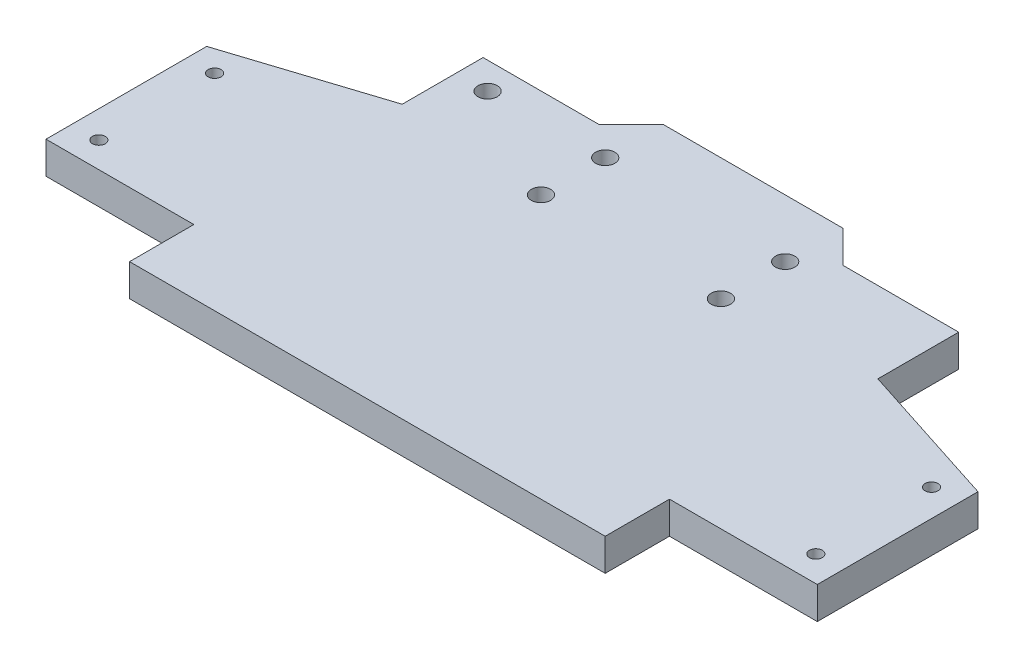
ISO-10303-21;
HEADER;
FILE_DESCRIPTION(('STEP AP214'),'2;1');
FILE_NAME('part.step','',(''),(''),'','','');
FILE_SCHEMA(('AUTOMOTIVE_DESIGN { 1 0 10303 214 1 1 1 1 }'));
ENDSEC;
DATA;
#1=APPLICATION_CONTEXT('core data for automotive mechanical design processes');
#2=APPLICATION_PROTOCOL_DEFINITION('international standard','automotive_design',2000,#1);
#3=PRODUCT_CONTEXT('',#1,'mechanical');
#4=PRODUCT('Part','Part','',(#3));
#5=PRODUCT_RELATED_PRODUCT_CATEGORY('part','',(#4));
#6=PRODUCT_DEFINITION_FORMATION('','',#4);
#7=PRODUCT_DEFINITION_CONTEXT('part definition',#1,'design');
#8=PRODUCT_DEFINITION('design','',#6,#7);
#9=PRODUCT_DEFINITION_SHAPE('','',#8);
#10=(LENGTH_UNIT() NAMED_UNIT(*) SI_UNIT(.MILLI.,.METRE.));
#11=(NAMED_UNIT(*) PLANE_ANGLE_UNIT() SI_UNIT($,.RADIAN.));
#12=(NAMED_UNIT(*) SI_UNIT($,.STERADIAN.) SOLID_ANGLE_UNIT());
#13=UNCERTAINTY_MEASURE_WITH_UNIT(LENGTH_MEASURE(1.E-05),#10,'distance_accuracy_value','');
#14=(GEOMETRIC_REPRESENTATION_CONTEXT(3) GLOBAL_UNCERTAINTY_ASSIGNED_CONTEXT((#13)) GLOBAL_UNIT_ASSIGNED_CONTEXT((#10,
#11,#12)) REPRESENTATION_CONTEXT('',''));
#15=CARTESIAN_POINT('',(0.,0.,0.));
#16=DIRECTION('',(0.,0.,1.));
#17=DIRECTION('',(1.,0.,0.));
#18=AXIS2_PLACEMENT_3D('',#15,#16,#17);
#19=CARTESIAN_POINT('',(-74.,3.,140.));
#20=DIRECTION('',(0.,0.,-1.));
#21=DIRECTION('',(-1.,0.,0.));
#22=AXIS2_PLACEMENT_3D('',#19,#20,#21);
#23=PLANE('',#22);
#24=DIRECTION('',(1.,0.,0.));
#25=VECTOR('',#24,1.);
#26=CARTESIAN_POINT('',(-74.,0.,140.));
#27=LINE('',#26,#25);
#28=CARTESIAN_POINT('',(-74.,0.,140.));
#29=VERTEX_POINT('',#28);
#30=CARTESIAN_POINT('',(-51.,0.,140.));
#31=VERTEX_POINT('',#30);
#32=EDGE_CURVE('E244',#29,#31,#27,.T.);
#33=ORIENTED_EDGE('',*,*,#32,.T.);
#34=DIRECTION('',(0.,-1.,0.));
#35=VECTOR('',#34,1.);
#36=CARTESIAN_POINT('',(-51.,5.,140.));
#37=LINE('',#36,#35);
#38=CARTESIAN_POINT('',(-51.,5.,140.));
#39=VERTEX_POINT('',#38);
#40=EDGE_CURVE('E217',#39,#31,#37,.T.);
#41=ORIENTED_EDGE('',*,*,#40,.F.);
#42=DIRECTION('',(1.,0.,0.));
#43=VECTOR('',#42,1.);
#44=CARTESIAN_POINT('',(-74.,5.,140.));
#45=LINE('',#44,#43);
#46=CARTESIAN_POINT('',(-74.,5.,140.));
#47=VERTEX_POINT('',#46);
#48=EDGE_CURVE('E213',#47,#39,#45,.T.);
#49=ORIENTED_EDGE('',*,*,#48,.F.);
#50=DIRECTION('',(0.,-1.,0.));
#51=VECTOR('',#50,1.);
#52=CARTESIAN_POINT('',(-74.,3.,140.));
#53=LINE('',#52,#51);
#54=EDGE_CURVE('E261',#47,#29,#53,.T.);
#55=ORIENTED_EDGE('',*,*,#54,.T.);
#56=EDGE_LOOP('',(#33,#41,#49,#55));
#57=FACE_BOUND('',#56,.T.);
#58=ADVANCED_FACE('F37',(#57),#23,.F.);
#59=DIRECTION('',(0.,-1.,0.));
#60=VECTOR('',#59,1.);
#61=CARTESIAN_POINT('',(23.,5.,140.));
#62=LINE('',#61,#60);
#63=CARTESIAN_POINT('',(23.,5.,140.));
#64=VERTEX_POINT('',#63);
#65=CARTESIAN_POINT('',(23.,0.,140.));
#66=VERTEX_POINT('',#65);
#67=EDGE_CURVE('E179',#64,#66,#62,.T.);
#68=ORIENTED_EDGE('',*,*,#67,.T.);
#69=CARTESIAN_POINT('',(46.,0.,140.));
#70=VERTEX_POINT('',#69);
#71=EDGE_CURVE('E243',#66,#70,#27,.T.);
#72=ORIENTED_EDGE('',*,*,#71,.T.);
#73=DIRECTION('',(0.,-1.,0.));
#74=VECTOR('',#73,1.);
#75=CARTESIAN_POINT('',(46.,3.,140.));
#76=LINE('',#75,#74);
#77=CARTESIAN_POINT('',(46.,5.,140.));
#78=VERTEX_POINT('',#77);
#79=EDGE_CURVE('E44',#78,#70,#76,.T.);
#80=ORIENTED_EDGE('',*,*,#79,.F.);
#81=DIRECTION('',(1.,0.,0.));
#82=VECTOR('',#81,1.);
#83=CARTESIAN_POINT('',(46.,5.,140.));
#84=LINE('',#83,#82);
#85=EDGE_CURVE('E190',#64,#78,#84,.T.);
#86=ORIENTED_EDGE('',*,*,#85,.F.);
#87=EDGE_LOOP('',(#68,#72,#80,#86));
#88=FACE_BOUND('',#87,.T.);
#89=ADVANCED_FACE('F280',(#88),#23,.F.);
#90=CARTESIAN_POINT('',(15.,3.,105.));
#91=DIRECTION('',(-0.307002779922758,0.,0.951708617760551));
#92=DIRECTION('',(0.951708617760551,0.,0.307002779922758));
#93=AXIS2_PLACEMENT_3D('',#90,#91,#92);
#94=PLANE('',#93);
#95=DIRECTION('',(-0.951708617760551,0.,-0.307002779922758));
#96=VECTOR('',#95,1.);
#97=CARTESIAN_POINT('',(15.,0.,105.));
#98=LINE('',#97,#96);
#99=CARTESIAN_POINT('',(46.,0.,115.));
#100=VERTEX_POINT('',#99);
#101=CARTESIAN_POINT('',(23.,0.,107.58064516129));
#102=VERTEX_POINT('',#101);
#103=EDGE_CURVE('E249',#100,#102,#98,.T.);
#104=ORIENTED_EDGE('',*,*,#103,.T.);
#105=DIRECTION('',(0.,-1.,0.));
#106=VECTOR('',#105,1.);
#107=CARTESIAN_POINT('',(23.,5.,107.58064516129));
#108=LINE('',#107,#106);
#109=CARTESIAN_POINT('',(23.,5.,107.58064516129));
#110=VERTEX_POINT('',#109);
#111=EDGE_CURVE('E176',#110,#102,#108,.T.);
#112=ORIENTED_EDGE('',*,*,#111,.F.);
#113=DIRECTION('',(-0.951708617760551,0.,-0.307002779922758));
#114=VECTOR('',#113,1.);
#115=CARTESIAN_POINT('',(23.,5.,107.58064516129));
#116=LINE('',#115,#114);
#117=CARTESIAN_POINT('',(46.,5.,115.));
#118=VERTEX_POINT('',#117);
#119=EDGE_CURVE('E193',#118,#110,#116,.T.);
#120=ORIENTED_EDGE('',*,*,#119,.F.);
#121=DIRECTION('',(0.,-1.,0.));
#122=VECTOR('',#121,1.);
#123=CARTESIAN_POINT('',(46.,3.,115.));
#124=LINE('',#123,#122);
#125=EDGE_CURVE('E271',#118,#100,#124,.T.);
#126=ORIENTED_EDGE('',*,*,#125,.T.);
#127=EDGE_LOOP('',(#104,#112,#120,#126));
#128=FACE_BOUND('',#127,.T.);
#129=ADVANCED_FACE('F308',(#128),#94,.F.);
#130=CARTESIAN_POINT('',(0.,3.,90.));
#131=DIRECTION('',(-0.707106781186548,0.,0.707106781186547));
#132=DIRECTION('',(0.707106781186547,0.,0.707106781186548));
#133=AXIS2_PLACEMENT_3D('',#130,#131,#132);
#134=PLANE('',#133);
#135=DIRECTION('',(0.,-1.,0.));
#136=VECTOR('',#135,1.);
#137=CARTESIAN_POINT('',(5.00000000000003,5.,95.));
#138=LINE('',#137,#136);
#139=CARTESIAN_POINT('',(5.00000000000003,5.,95.));
#140=VERTEX_POINT('',#139);
#141=CARTESIAN_POINT('',(5.00000000000003,0.,95.));
#142=VERTEX_POINT('',#141);
#143=EDGE_CURVE('E319',#140,#142,#138,.T.);
#144=ORIENTED_EDGE('',*,*,#143,.T.);
#145=DIRECTION('',(-0.707106781186547,0.,-0.707106781186548));
#146=VECTOR('',#145,1.);
#147=CARTESIAN_POINT('',(0.,0.,90.));
#148=LINE('',#147,#146);
#149=CARTESIAN_POINT('',(0.,0.,90.));
#150=VERTEX_POINT('',#149);
#151=EDGE_CURVE('E252',#142,#150,#148,.T.);
#152=ORIENTED_EDGE('',*,*,#151,.T.);
#153=DIRECTION('',(0.,-1.,0.));
#154=VECTOR('',#153,1.);
#155=CARTESIAN_POINT('',(0.,3.,90.));
#156=LINE('',#155,#154);
#157=CARTESIAN_POINT('',(0.,5.,90.));
#158=VERTEX_POINT('',#157);
#159=EDGE_CURVE('E268',#158,#150,#156,.T.);
#160=ORIENTED_EDGE('',*,*,#159,.F.);
#161=DIRECTION('',(-0.707106781186548,0.,-0.707106781186547));
#162=VECTOR('',#161,1.);
#163=CARTESIAN_POINT('',(-45.,5.,45.));
#164=LINE('',#163,#162);
#165=EDGE_CURVE('E323',#140,#158,#164,.T.);
#166=ORIENTED_EDGE('',*,*,#165,.F.);
#167=EDGE_LOOP('',(#144,#152,#160,#166));
#168=FACE_BOUND('',#167,.T.);
#169=ADVANCED_FACE('F341',(#168),#134,.F.);
#170=CARTESIAN_POINT('',(-28.,3.,90.));
#171=DIRECTION('',(0.707106781186548,0.,0.707106781186547));
#172=DIRECTION('',(0.707106781186547,0.,-0.707106781186548));
#173=AXIS2_PLACEMENT_3D('',#170,#171,#172);
#174=PLANE('',#173);
#175=DIRECTION('',(0.,-1.,0.));
#176=VECTOR('',#175,1.);
#177=CARTESIAN_POINT('',(-33.,3.,95.));
#178=LINE('',#177,#176);
#179=CARTESIAN_POINT('',(-33.,5.,95.));
#180=VERTEX_POINT('',#179);
#181=CARTESIAN_POINT('',(-33.,0.,95.));
#182=VERTEX_POINT('',#181);
#183=EDGE_CURVE('E11',#180,#182,#178,.T.);
#184=ORIENTED_EDGE('',*,*,#183,.F.);
#185=DIRECTION('',(-0.707106781186547,0.,0.707106781186548));
#186=VECTOR('',#185,1.);
#187=CARTESIAN_POINT('',(31.,5.,31.));
#188=LINE('',#187,#186);
#189=CARTESIAN_POINT('',(-28.,5.,90.));
#190=VERTEX_POINT('',#189);
#191=EDGE_CURVE('E169',#190,#180,#188,.T.);
#192=ORIENTED_EDGE('',*,*,#191,.F.);
#193=DIRECTION('',(0.,-1.,0.));
#194=VECTOR('',#193,1.);
#195=CARTESIAN_POINT('',(-28.,3.,90.));
#196=LINE('',#195,#194);
#197=CARTESIAN_POINT('',(-28.,0.,90.));
#198=VERTEX_POINT('',#197);
#199=EDGE_CURVE('E265',#190,#198,#196,.T.);
#200=ORIENTED_EDGE('',*,*,#199,.T.);
#201=DIRECTION('',(-0.707106781186547,0.,0.707106781186548));
#202=VECTOR('',#201,1.);
#203=CARTESIAN_POINT('',(-28.,0.,90.));
#204=LINE('',#203,#202);
#205=EDGE_CURVE('E256',#198,#182,#204,.T.);
#206=ORIENTED_EDGE('',*,*,#205,.T.);
#207=EDGE_LOOP('',(#184,#192,#200,#206));
#208=FACE_BOUND('',#207,.T.);
#209=ADVANCED_FACE('F348',(#208),#174,.F.);
#210=CARTESIAN_POINT('',(-74.,3.,115.));
#211=DIRECTION('',(0.307002779922758,0.,0.951708617760551));
#212=DIRECTION('',(0.951708617760551,0.,-0.307002779922758));
#213=AXIS2_PLACEMENT_3D('',#210,#211,#212);
#214=PLANE('',#213);
#215=DIRECTION('',(0.,-1.,0.));
#216=VECTOR('',#215,1.);
#217=CARTESIAN_POINT('',(-51.,5.,107.58064516129));
#218=LINE('',#217,#216);
#219=CARTESIAN_POINT('',(-51.,5.,107.58064516129));
#220=VERTEX_POINT('',#219);
#221=CARTESIAN_POINT('',(-51.,0.,107.58064516129));
#222=VERTEX_POINT('',#221);
#223=EDGE_CURVE('E155',#220,#222,#218,.T.);
#224=ORIENTED_EDGE('',*,*,#223,.T.);
#225=DIRECTION('',(-0.951708617760551,0.,0.307002779922758));
#226=VECTOR('',#225,1.);
#227=CARTESIAN_POINT('',(-74.,0.,115.));
#228=LINE('',#227,#226);
#229=CARTESIAN_POINT('',(-74.,0.,115.));
#230=VERTEX_POINT('',#229);
#231=EDGE_CURVE('E59',#222,#230,#228,.T.);
#232=ORIENTED_EDGE('',*,*,#231,.T.);
#233=DIRECTION('',(0.,-1.,0.));
#234=VECTOR('',#233,1.);
#235=CARTESIAN_POINT('',(-74.,3.,115.));
#236=LINE('',#235,#234);
#237=CARTESIAN_POINT('',(-74.,5.,115.));
#238=VERTEX_POINT('',#237);
#239=EDGE_CURVE('E263',#238,#230,#236,.T.);
#240=ORIENTED_EDGE('',*,*,#239,.F.);
#241=DIRECTION('',(-0.951708617760551,0.,0.307002779922758));
#242=VECTOR('',#241,1.);
#243=CARTESIAN_POINT('',(-74.,5.,115.));
#244=LINE('',#243,#242);
#245=EDGE_CURVE('E208',#220,#238,#244,.T.);
#246=ORIENTED_EDGE('',*,*,#245,.F.);
#247=EDGE_LOOP('',(#224,#232,#240,#246));
#248=FACE_BOUND('',#247,.T.);
#249=ADVANCED_FACE('F356',(#248),#214,.F.);
#250=CARTESIAN_POINT('',(0.,0.,0.));
#251=DIRECTION('',(0.,1.,0.));
#252=DIRECTION('',(0.,0.,1.));
#253=AXIS2_PLACEMENT_3D('',#250,#251,#252);
#254=PLANE('',#253);
#255=CARTESIAN_POINT('',(-46.11,0.,99.19));
#256=DIRECTION('',(0.,1.,0.));
#257=DIRECTION('',(0.,0.,1.));
#258=AXIS2_PLACEMENT_3D('',#255,#256,#257);
#259=CIRCLE('',#258,1.5);
#260=CARTESIAN_POINT('',(-46.11,0.,100.69));
#261=VERTEX_POINT('',#260);
#262=EDGE_CURVE('E447',#261,#261,#259,.T.);
#263=ORIENTED_EDGE('',*,*,#262,.T.);
#264=EDGE_LOOP('',(#263));
#265=FACE_BOUND('',#264,.T.);
#266=DIRECTION('',(0.,0.,-1.));
#267=VECTOR('',#266,1.);
#268=CARTESIAN_POINT('',(23.,0.,0.));
#269=LINE('',#268,#267);
#270=CARTESIAN_POINT('',(23.,0.,95.));
#271=VERTEX_POINT('',#270);
#272=EDGE_CURVE('E299',#102,#271,#269,.T.);
#273=ORIENTED_EDGE('',*,*,#272,.F.);
#274=ORIENTED_EDGE('',*,*,#103,.F.);
#275=DIRECTION('',(0.,0.,-1.));
#276=VECTOR('',#275,1.);
#277=CARTESIAN_POINT('',(46.,0.,140.));
#278=LINE('',#277,#276);
#279=EDGE_CURVE('E247',#70,#100,#278,.T.);
#280=ORIENTED_EDGE('',*,*,#279,.F.);
#281=ORIENTED_EDGE('',*,*,#71,.F.);
#282=CARTESIAN_POINT('',(23.,0.,150.));
#283=VERTEX_POINT('',#282);
#284=EDGE_CURVE('E296',#283,#66,#269,.T.);
#285=ORIENTED_EDGE('',*,*,#284,.F.);
#286=DIRECTION('',(1.,0.,0.));
#287=VECTOR('',#286,1.);
#288=CARTESIAN_POINT('',(0.,0.,150.));
#289=LINE('',#288,#287);
#290=CARTESIAN_POINT('',(-51.,0.,150.));
#291=VERTEX_POINT('',#290);
#292=EDGE_CURVE('E336',#291,#283,#289,.T.);
#293=ORIENTED_EDGE('',*,*,#292,.F.);
#294=DIRECTION('',(0.,0.,1.));
#295=VECTOR('',#294,1.);
#296=CARTESIAN_POINT('',(-51.,0.,0.));
#297=LINE('',#296,#295);
#298=EDGE_CURVE('E332',#31,#291,#297,.T.);
#299=ORIENTED_EDGE('',*,*,#298,.F.);
#300=ORIENTED_EDGE('',*,*,#32,.F.);
#301=DIRECTION('',(0.,0.,1.));
#302=VECTOR('',#301,1.);
#303=CARTESIAN_POINT('',(-74.,0.,115.));
#304=LINE('',#303,#302);
#305=EDGE_CURVE('E51',#230,#29,#304,.T.);
#306=ORIENTED_EDGE('',*,*,#305,.F.);
#307=ORIENTED_EDGE('',*,*,#231,.F.);
#308=CARTESIAN_POINT('',(-51.,0.,95.));
#309=VERTEX_POINT('',#308);
#310=EDGE_CURVE('E334',#309,#222,#297,.T.);
#311=ORIENTED_EDGE('',*,*,#310,.F.);
#312=DIRECTION('',(-1.,0.,0.));
#313=VECTOR('',#312,1.);
#314=CARTESIAN_POINT('',(0.,0.,95.));
#315=LINE('',#314,#313);
#316=EDGE_CURVE('E175',#182,#309,#315,.T.);
#317=ORIENTED_EDGE('',*,*,#316,.F.);
#318=ORIENTED_EDGE('',*,*,#205,.F.);
#319=DIRECTION('',(-1.,0.,0.));
#320=VECTOR('',#319,1.);
#321=CARTESIAN_POINT('',(-28.,0.,90.));
#322=LINE('',#321,#320);
#323=EDGE_CURVE('E254',#150,#198,#322,.T.);
#324=ORIENTED_EDGE('',*,*,#323,.F.);
#325=ORIENTED_EDGE('',*,*,#151,.F.);
#326=DIRECTION('',(-1.,0.,0.));
#327=VECTOR('',#326,1.);
#328=CARTESIAN_POINT('',(0.,0.,95.));
#329=LINE('',#328,#327);
#330=EDGE_CURVE('E171',#271,#142,#329,.T.);
#331=ORIENTED_EDGE('',*,*,#330,.F.);
#332=EDGE_LOOP('',(#273,#274,#280,#281,#285,#293,#299,#300,#306,#307,#311,#317,#318,#324,#325,#331));
#333=FACE_BOUND('',#332,.T.);
#334=CARTESIAN_POINT('',(-28.,0.,99.));
#335=DIRECTION('',(0.,1.,0.));
#336=DIRECTION('',(0.,0.,1.));
#337=AXIS2_PLACEMENT_3D('',#334,#335,#336);
#338=CIRCLE('',#337,1.5);
#339=CARTESIAN_POINT('',(-28.,0.,100.5));
#340=VERTEX_POINT('',#339);
#341=EDGE_CURVE('E228',#340,#340,#338,.T.);
#342=ORIENTED_EDGE('',*,*,#341,.T.);
#343=EDGE_LOOP('',(#342));
#344=FACE_BOUND('',#343,.T.);
#345=CARTESIAN_POINT('',(0.,0.,99.));
#346=DIRECTION('',(0.,1.,0.));
#347=DIRECTION('',(0.,0.,1.));
#348=AXIS2_PLACEMENT_3D('',#345,#346,#347);
#349=CIRCLE('',#348,1.5);
#350=CARTESIAN_POINT('',(0.,0.,100.5));
#351=VERTEX_POINT('',#350);
#352=EDGE_CURVE('E225',#351,#351,#349,.T.);
#353=ORIENTED_EDGE('',*,*,#352,.T.);
#354=EDGE_LOOP('',(#353));
#355=FACE_BOUND('',#354,.T.);
#356=CARTESIAN_POINT('',(-28.,0.,109.));
#357=DIRECTION('',(0.,1.,0.));
#358=DIRECTION('',(0.,0.,1.));
#359=AXIS2_PLACEMENT_3D('',#356,#357,#358);
#360=CIRCLE('',#359,1.5);
#361=CARTESIAN_POINT('',(-28.,0.,110.5));
#362=VERTEX_POINT('',#361);
#363=EDGE_CURVE('E222',#362,#362,#360,.T.);
#364=ORIENTED_EDGE('',*,*,#363,.T.);
#365=EDGE_LOOP('',(#364));
#366=FACE_BOUND('',#365,.T.);
#367=CARTESIAN_POINT('',(0.,0.,109.));
#368=DIRECTION('',(0.,1.,0.));
#369=DIRECTION('',(0.,0.,1.));
#370=AXIS2_PLACEMENT_3D('',#367,#368,#369);
#371=CIRCLE('',#370,1.5);
#372=CARTESIAN_POINT('',(0.,0.,110.5));
#373=VERTEX_POINT('',#372);
#374=EDGE_CURVE('E219',#373,#373,#371,.T.);
#375=ORIENTED_EDGE('',*,*,#374,.T.);
#376=EDGE_LOOP('',(#375));
#377=FACE_BOUND('',#376,.T.);
#378=CARTESIAN_POINT('',(41.77,0.,118.));
#379=DIRECTION('',(0.,1.,0.));
#380=DIRECTION('',(0.,0.,-1.));
#381=AXIS2_PLACEMENT_3D('',#378,#379,#380);
#382=CIRCLE('',#381,0.999999999999998);
#383=CARTESIAN_POINT('',(41.77,0.,117.));
#384=VERTEX_POINT('',#383);
#385=EDGE_CURVE('E231',#384,#384,#382,.T.);
#386=ORIENTED_EDGE('',*,*,#385,.T.);
#387=EDGE_LOOP('',(#386));
#388=FACE_BOUND('',#387,.T.);
#389=CARTESIAN_POINT('',(41.77,0.,136.));
#390=DIRECTION('',(0.,1.,0.));
#391=DIRECTION('',(0.,0.,-1.));
#392=AXIS2_PLACEMENT_3D('',#389,#390,#391);
#393=CIRCLE('',#392,0.999999999999998);
#394=CARTESIAN_POINT('',(41.77,0.,135.));
#395=VERTEX_POINT('',#394);
#396=EDGE_CURVE('E234',#395,#395,#393,.T.);
#397=ORIENTED_EDGE('',*,*,#396,.T.);
#398=EDGE_LOOP('',(#397));
#399=FACE_BOUND('',#398,.T.);
#400=CARTESIAN_POINT('',(-69.77,0.,118.));
#401=DIRECTION('',(0.,1.,0.));
#402=DIRECTION('',(0.,0.,1.));
#403=AXIS2_PLACEMENT_3D('',#400,#401,#402);
#404=CIRCLE('',#403,0.999999999999998);
#405=CARTESIAN_POINT('',(-69.77,0.,119.));
#406=VERTEX_POINT('',#405);
#407=EDGE_CURVE('E237',#406,#406,#404,.T.);
#408=ORIENTED_EDGE('',*,*,#407,.T.);
#409=EDGE_LOOP('',(#408));
#410=FACE_BOUND('',#409,.T.);
#411=CARTESIAN_POINT('',(-69.77,0.,136.));
#412=DIRECTION('',(0.,1.,0.));
#413=DIRECTION('',(0.,0.,1.));
#414=AXIS2_PLACEMENT_3D('',#411,#412,#413);
#415=CIRCLE('',#414,0.999999999999998);
#416=CARTESIAN_POINT('',(-69.77,0.,137.));
#417=VERTEX_POINT('',#416);
#418=EDGE_CURVE('E240',#417,#417,#415,.T.);
#419=ORIENTED_EDGE('',*,*,#418,.T.);
#420=EDGE_LOOP('',(#419));
#421=FACE_BOUND('',#420,.T.);
#422=ADVANCED_FACE('F302',(#265,#333,#344,#355,#366,#377,#388,#399,#410,#421),#254,.F.);
#423=CARTESIAN_POINT('',(46.,3.,140.));
#424=DIRECTION('',(-1.,0.,0.));
#425=DIRECTION('',(0.,0.,1.));
#426=AXIS2_PLACEMENT_3D('',#423,#424,#425);
#427=PLANE('',#426);
#428=ORIENTED_EDGE('',*,*,#279,.T.);
#429=ORIENTED_EDGE('',*,*,#125,.F.);
#430=DIRECTION('',(0.,0.,-1.));
#431=VECTOR('',#430,1.);
#432=CARTESIAN_POINT('',(46.,5.,115.));
#433=LINE('',#432,#431);
#434=EDGE_CURVE('E187',#78,#118,#433,.T.);
#435=ORIENTED_EDGE('',*,*,#434,.F.);
#436=ORIENTED_EDGE('',*,*,#79,.T.);
#437=EDGE_LOOP('',(#428,#429,#435,#436));
#438=FACE_BOUND('',#437,.T.);
#439=ADVANCED_FACE('F276',(#438),#427,.F.);
#440=CARTESIAN_POINT('',(-28.,3.,90.));
#441=DIRECTION('',(0.,0.,1.));
#442=DIRECTION('',(1.,0.,0.));
#443=AXIS2_PLACEMENT_3D('',#440,#441,#442);
#444=PLANE('',#443);
#445=ORIENTED_EDGE('',*,*,#323,.T.);
#446=ORIENTED_EDGE('',*,*,#199,.F.);
#447=DIRECTION('',(-1.,0.,0.));
#448=VECTOR('',#447,1.);
#449=CARTESIAN_POINT('',(0.,5.,90.));
#450=LINE('',#449,#448);
#451=EDGE_CURVE('E325',#158,#190,#450,.T.);
#452=ORIENTED_EDGE('',*,*,#451,.F.);
#453=ORIENTED_EDGE('',*,*,#159,.T.);
#454=EDGE_LOOP('',(#445,#446,#452,#453));
#455=FACE_BOUND('',#454,.T.);
#456=ADVANCED_FACE('F345',(#455),#444,.F.);
#457=CARTESIAN_POINT('',(-74.,3.,115.));
#458=DIRECTION('',(1.,0.,0.));
#459=DIRECTION('',(0.,0.,-1.));
#460=AXIS2_PLACEMENT_3D('',#457,#458,#459);
#461=PLANE('',#460);
#462=ORIENTED_EDGE('',*,*,#305,.T.);
#463=ORIENTED_EDGE('',*,*,#54,.F.);
#464=DIRECTION('',(0.,0.,1.));
#465=VECTOR('',#464,1.);
#466=CARTESIAN_POINT('',(-74.,5.,115.));
#467=LINE('',#466,#465);
#468=EDGE_CURVE('E210',#238,#47,#467,.T.);
#469=ORIENTED_EDGE('',*,*,#468,.F.);
#470=ORIENTED_EDGE('',*,*,#239,.T.);
#471=EDGE_LOOP('',(#462,#463,#469,#470));
#472=FACE_BOUND('',#471,.T.);
#473=ADVANCED_FACE('F355',(#472),#461,.F.);
#474=CARTESIAN_POINT('',(-69.77,3.,136.));
#475=DIRECTION('',(0.,-1.,0.));
#476=DIRECTION('',(0.,0.,-1.));
#477=AXIS2_PLACEMENT_3D('',#474,#475,#476);
#478=CYLINDRICAL_SURFACE('',#477,0.999999999999998);
#479=ORIENTED_EDGE('',*,*,#418,.F.);
#480=EDGE_LOOP('',(#479));
#481=FACE_BOUND('',#480,.T.);
#482=CARTESIAN_POINT('',(-69.77,5.,136.));
#483=DIRECTION('',(0.,1.,0.));
#484=DIRECTION('',(0.,0.,1.));
#485=AXIS2_PLACEMENT_3D('',#482,#483,#484);
#486=CIRCLE('',#485,1.00000000000001);
#487=CARTESIAN_POINT('',(-69.77,5.,137.));
#488=VERTEX_POINT('',#487);
#489=EDGE_CURVE('E202',#488,#488,#486,.T.);
#490=ORIENTED_EDGE('',*,*,#489,.T.);
#491=EDGE_LOOP('',(#490));
#492=FACE_BOUND('',#491,.T.);
#493=ADVANCED_FACE('F387',(#481,#492),#478,.F.);
#494=CARTESIAN_POINT('',(-69.77,3.,118.));
#495=DIRECTION('',(0.,-1.,0.));
#496=DIRECTION('',(0.,0.,-1.));
#497=AXIS2_PLACEMENT_3D('',#494,#495,#496);
#498=CYLINDRICAL_SURFACE('',#497,0.999999999999998);
#499=ORIENTED_EDGE('',*,*,#407,.F.);
#500=EDGE_LOOP('',(#499));
#501=FACE_BOUND('',#500,.T.);
#502=CARTESIAN_POINT('',(-69.77,5.,118.));
#503=DIRECTION('',(0.,1.,0.));
#504=DIRECTION('',(0.,0.,1.));
#505=AXIS2_PLACEMENT_3D('',#502,#503,#504);
#506=CIRCLE('',#505,0.999999999999998);
#507=CARTESIAN_POINT('',(-69.77,5.,119.));
#508=VERTEX_POINT('',#507);
#509=EDGE_CURVE('E205',#508,#508,#506,.T.);
#510=ORIENTED_EDGE('',*,*,#509,.T.);
#511=EDGE_LOOP('',(#510));
#512=FACE_BOUND('',#511,.T.);
#513=ADVANCED_FACE('F391',(#501,#512),#498,.F.);
#514=CARTESIAN_POINT('',(41.77,3.,136.));
#515=DIRECTION('',(0.,-1.,0.));
#516=DIRECTION('',(0.,0.,-1.));
#517=AXIS2_PLACEMENT_3D('',#514,#515,#516);
#518=CYLINDRICAL_SURFACE('',#517,0.999999999999998);
#519=ORIENTED_EDGE('',*,*,#396,.F.);
#520=EDGE_LOOP('',(#519));
#521=FACE_BOUND('',#520,.T.);
#522=CARTESIAN_POINT('',(41.77,5.,136.));
#523=DIRECTION('',(0.,1.,0.));
#524=DIRECTION('',(0.,0.,1.));
#525=AXIS2_PLACEMENT_3D('',#522,#523,#524);
#526=CIRCLE('',#525,0.999999999999998);
#527=CARTESIAN_POINT('',(41.77,5.,137.));
#528=VERTEX_POINT('',#527);
#529=EDGE_CURVE('E199',#528,#528,#526,.T.);
#530=ORIENTED_EDGE('',*,*,#529,.T.);
#531=EDGE_LOOP('',(#530));
#532=FACE_BOUND('',#531,.T.);
#533=ADVANCED_FACE('F397',(#521,#532),#518,.F.);
#534=CARTESIAN_POINT('',(41.77,3.,118.));
#535=DIRECTION('',(0.,-1.,0.));
#536=DIRECTION('',(0.,0.,-1.));
#537=AXIS2_PLACEMENT_3D('',#534,#535,#536);
#538=CYLINDRICAL_SURFACE('',#537,0.999999999999998);
#539=ORIENTED_EDGE('',*,*,#385,.F.);
#540=EDGE_LOOP('',(#539));
#541=FACE_BOUND('',#540,.T.);
#542=CARTESIAN_POINT('',(41.77,5.,118.));
#543=DIRECTION('',(0.,1.,0.));
#544=DIRECTION('',(0.,0.,1.));
#545=AXIS2_PLACEMENT_3D('',#542,#543,#544);
#546=CIRCLE('',#545,1.00000000000001);
#547=CARTESIAN_POINT('',(41.77,5.,119.));
#548=VERTEX_POINT('',#547);
#549=EDGE_CURVE('E196',#548,#548,#546,.T.);
#550=ORIENTED_EDGE('',*,*,#549,.T.);
#551=EDGE_LOOP('',(#550));
#552=FACE_BOUND('',#551,.T.);
#553=ADVANCED_FACE('F401',(#541,#552),#538,.F.);
#554=CARTESIAN_POINT('',(-28.,3.,99.));
#555=DIRECTION('',(0.,-1.,0.));
#556=DIRECTION('',(0.,0.,-1.));
#557=AXIS2_PLACEMENT_3D('',#554,#555,#556);
#558=CYLINDRICAL_SURFACE('',#557,1.5);
#559=ORIENTED_EDGE('',*,*,#341,.F.);
#560=EDGE_LOOP('',(#559));
#561=FACE_BOUND('',#560,.T.);
#562=CARTESIAN_POINT('',(-28.,5.,99.));
#563=DIRECTION('',(0.,1.,0.));
#564=DIRECTION('',(0.,0.,1.));
#565=AXIS2_PLACEMENT_3D('',#562,#563,#564);
#566=CIRCLE('',#565,1.5);
#567=CARTESIAN_POINT('',(-28.,5.,100.5));
#568=VERTEX_POINT('',#567);
#569=EDGE_CURVE('E333',#568,#568,#566,.T.);
#570=ORIENTED_EDGE('',*,*,#569,.T.);
#571=EDGE_LOOP('',(#570));
#572=FACE_BOUND('',#571,.T.);
#573=ADVANCED_FACE('F405',(#561,#572),#558,.F.);
#574=CARTESIAN_POINT('',(0.,3.,99.));
#575=DIRECTION('',(0.,-1.,0.));
#576=DIRECTION('',(0.,0.,-1.));
#577=AXIS2_PLACEMENT_3D('',#574,#575,#576);
#578=CYLINDRICAL_SURFACE('',#577,1.5);
#579=ORIENTED_EDGE('',*,*,#352,.F.);
#580=EDGE_LOOP('',(#579));
#581=FACE_BOUND('',#580,.T.);
#582=CARTESIAN_POINT('',(0.,5.,99.));
#583=DIRECTION('',(0.,1.,0.));
#584=DIRECTION('',(0.,0.,1.));
#585=AXIS2_PLACEMENT_3D('',#582,#583,#584);
#586=CIRCLE('',#585,1.5);
#587=CARTESIAN_POINT('',(0.,5.,100.5));
#588=VERTEX_POINT('',#587);
#589=EDGE_CURVE('E460',#588,#588,#586,.T.);
#590=ORIENTED_EDGE('',*,*,#589,.T.);
#591=EDGE_LOOP('',(#590));
#592=FACE_BOUND('',#591,.T.);
#593=ADVANCED_FACE('F409',(#581,#592),#578,.F.);
#594=CARTESIAN_POINT('',(-28.,3.,109.));
#595=DIRECTION('',(0.,-1.,0.));
#596=DIRECTION('',(0.,0.,-1.));
#597=AXIS2_PLACEMENT_3D('',#594,#595,#596);
#598=CYLINDRICAL_SURFACE('',#597,1.5);
#599=ORIENTED_EDGE('',*,*,#363,.F.);
#600=EDGE_LOOP('',(#599));
#601=FACE_BOUND('',#600,.T.);
#602=CARTESIAN_POINT('',(-28.,5.,109.));
#603=DIRECTION('',(0.,1.,0.));
#604=DIRECTION('',(0.,0.,1.));
#605=AXIS2_PLACEMENT_3D('',#602,#603,#604);
#606=CIRCLE('',#605,1.5);
#607=CARTESIAN_POINT('',(-28.,5.,110.5));
#608=VERTEX_POINT('',#607);
#609=EDGE_CURVE('E452',#608,#608,#606,.T.);
#610=ORIENTED_EDGE('',*,*,#609,.T.);
#611=EDGE_LOOP('',(#610));
#612=FACE_BOUND('',#611,.T.);
#613=ADVANCED_FACE('F413',(#601,#612),#598,.F.);
#614=CARTESIAN_POINT('',(0.,3.,109.));
#615=DIRECTION('',(0.,-1.,0.));
#616=DIRECTION('',(0.,0.,-1.));
#617=AXIS2_PLACEMENT_3D('',#614,#615,#616);
#618=CYLINDRICAL_SURFACE('',#617,1.5);
#619=ORIENTED_EDGE('',*,*,#374,.F.);
#620=EDGE_LOOP('',(#619));
#621=FACE_BOUND('',#620,.T.);
#622=CARTESIAN_POINT('',(0.,5.,109.));
#623=DIRECTION('',(0.,1.,0.));
#624=DIRECTION('',(0.,0.,1.));
#625=AXIS2_PLACEMENT_3D('',#622,#623,#624);
#626=CIRCLE('',#625,1.5);
#627=CARTESIAN_POINT('',(0.,5.,110.5));
#628=VERTEX_POINT('',#627);
#629=EDGE_CURVE('E457',#628,#628,#626,.T.);
#630=ORIENTED_EDGE('',*,*,#629,.T.);
#631=EDGE_LOOP('',(#630));
#632=FACE_BOUND('',#631,.T.);
#633=ADVANCED_FACE('F417',(#621,#632),#618,.F.);
#634=CARTESIAN_POINT('',(0.,5.,0.));
#635=DIRECTION('',(0.,-1.,0.));
#636=DIRECTION('',(0.,0.,-1.));
#637=AXIS2_PLACEMENT_3D('',#634,#635,#636);
#638=PLANE('',#637);
#639=CARTESIAN_POINT('',(-46.11,5.,99.19));
#640=DIRECTION('',(0.,1.,0.));
#641=DIRECTION('',(0.,0.,1.));
#642=AXIS2_PLACEMENT_3D('',#639,#640,#641);
#643=CIRCLE('',#642,1.5);
#644=CARTESIAN_POINT('',(-46.11,5.,100.69));
#645=VERTEX_POINT('',#644);
#646=EDGE_CURVE('E450',#645,#645,#643,.T.);
#647=ORIENTED_EDGE('',*,*,#646,.F.);
#648=EDGE_LOOP('',(#647));
#649=FACE_BOUND('',#648,.T.);
#650=ORIENTED_EDGE('',*,*,#245,.T.);
#651=ORIENTED_EDGE('',*,*,#468,.T.);
#652=ORIENTED_EDGE('',*,*,#48,.T.);
#653=DIRECTION('',(0.,0.,1.));
#654=VECTOR('',#653,1.);
#655=CARTESIAN_POINT('',(-51.,5.,0.));
#656=LINE('',#655,#654);
#657=CARTESIAN_POINT('',(-51.,5.,150.));
#658=VERTEX_POINT('',#657);
#659=EDGE_CURVE('E160',#39,#658,#656,.T.);
#660=ORIENTED_EDGE('',*,*,#659,.T.);
#661=DIRECTION('',(1.,0.,0.));
#662=VECTOR('',#661,1.);
#663=CARTESIAN_POINT('',(0.,5.,150.));
#664=LINE('',#663,#662);
#665=CARTESIAN_POINT('',(23.,5.,150.));
#666=VERTEX_POINT('',#665);
#667=EDGE_CURVE('E159',#658,#666,#664,.T.);
#668=ORIENTED_EDGE('',*,*,#667,.T.);
#669=DIRECTION('',(0.,0.,-1.));
#670=VECTOR('',#669,1.);
#671=CARTESIAN_POINT('',(23.,5.,0.));
#672=LINE('',#671,#670);
#673=EDGE_CURVE('E284',#666,#64,#672,.T.);
#674=ORIENTED_EDGE('',*,*,#673,.T.);
#675=ORIENTED_EDGE('',*,*,#85,.T.);
#676=ORIENTED_EDGE('',*,*,#434,.T.);
#677=ORIENTED_EDGE('',*,*,#119,.T.);
#678=CARTESIAN_POINT('',(23.,5.,95.));
#679=VERTEX_POINT('',#678);
#680=EDGE_CURVE('E291',#110,#679,#672,.T.);
#681=ORIENTED_EDGE('',*,*,#680,.T.);
#682=DIRECTION('',(-1.,0.,0.));
#683=VECTOR('',#682,1.);
#684=CARTESIAN_POINT('',(0.,5.,95.));
#685=LINE('',#684,#683);
#686=EDGE_CURVE('E290',#679,#140,#685,.T.);
#687=ORIENTED_EDGE('',*,*,#686,.T.);
#688=ORIENTED_EDGE('',*,*,#165,.T.);
#689=ORIENTED_EDGE('',*,*,#451,.T.);
#690=ORIENTED_EDGE('',*,*,#191,.T.);
#691=DIRECTION('',(-1.,0.,0.));
#692=VECTOR('',#691,1.);
#693=CARTESIAN_POINT('',(0.,5.,95.));
#694=LINE('',#693,#692);
#695=CARTESIAN_POINT('',(-51.,5.,95.));
#696=VERTEX_POINT('',#695);
#697=EDGE_CURVE('E164',#180,#696,#694,.T.);
#698=ORIENTED_EDGE('',*,*,#697,.T.);
#699=EDGE_CURVE('E148',#696,#220,#656,.T.);
#700=ORIENTED_EDGE('',*,*,#699,.T.);
#701=EDGE_LOOP('',(#650,#651,#652,#660,#668,#674,#675,#676,#677,#681,#687,#688,#689,#690,#698,#700));
#702=FACE_BOUND('',#701,.T.);
#703=ORIENTED_EDGE('',*,*,#509,.F.);
#704=EDGE_LOOP('',(#703));
#705=FACE_BOUND('',#704,.T.);
#706=ORIENTED_EDGE('',*,*,#489,.F.);
#707=EDGE_LOOP('',(#706));
#708=FACE_BOUND('',#707,.T.);
#709=ORIENTED_EDGE('',*,*,#549,.F.);
#710=EDGE_LOOP('',(#709));
#711=FACE_BOUND('',#710,.T.);
#712=ORIENTED_EDGE('',*,*,#529,.F.);
#713=EDGE_LOOP('',(#712));
#714=FACE_BOUND('',#713,.T.);
#715=ORIENTED_EDGE('',*,*,#629,.F.);
#716=EDGE_LOOP('',(#715));
#717=FACE_BOUND('',#716,.T.);
#718=ORIENTED_EDGE('',*,*,#569,.F.);
#719=EDGE_LOOP('',(#718));
#720=FACE_BOUND('',#719,.T.);
#721=ORIENTED_EDGE('',*,*,#589,.F.);
#722=EDGE_LOOP('',(#721));
#723=FACE_BOUND('',#722,.T.);
#724=ORIENTED_EDGE('',*,*,#609,.F.);
#725=EDGE_LOOP('',(#724));
#726=FACE_BOUND('',#725,.T.);
#727=ADVANCED_FACE('F165',(#649,#702,#705,#708,#711,#714,#717,#720,#723,#726),#638,.F.);
#728=CARTESIAN_POINT('',(-51.,5.,0.));
#729=DIRECTION('',(1.,0.,0.));
#730=DIRECTION('',(0.,0.,-1.));
#731=AXIS2_PLACEMENT_3D('',#728,#729,#730);
#732=PLANE('',#731);
#733=ORIENTED_EDGE('',*,*,#659,.F.);
#734=ORIENTED_EDGE('',*,*,#40,.T.);
#735=ORIENTED_EDGE('',*,*,#298,.T.);
#736=DIRECTION('',(0.,-1.,0.));
#737=VECTOR('',#736,1.);
#738=CARTESIAN_POINT('',(-51.,5.,150.));
#739=LINE('',#738,#737);
#740=EDGE_CURVE('E177',#658,#291,#739,.T.);
#741=ORIENTED_EDGE('',*,*,#740,.F.);
#742=EDGE_LOOP('',(#733,#734,#735,#741));
#743=FACE_BOUND('',#742,.T.);
#744=ADVANCED_FACE('F424',(#743),#732,.F.);
#745=ORIENTED_EDGE('',*,*,#310,.T.);
#746=ORIENTED_EDGE('',*,*,#223,.F.);
#747=ORIENTED_EDGE('',*,*,#699,.F.);
#748=DIRECTION('',(0.,-1.,0.));
#749=VECTOR('',#748,1.);
#750=CARTESIAN_POINT('',(-51.,5.,95.));
#751=LINE('',#750,#749);
#752=EDGE_CURVE('E153',#696,#309,#751,.T.);
#753=ORIENTED_EDGE('',*,*,#752,.T.);
#754=EDGE_LOOP('',(#745,#746,#747,#753));
#755=FACE_BOUND('',#754,.T.);
#756=ADVANCED_FACE('F151',(#755),#732,.F.);
#757=CARTESIAN_POINT('',(23.,5.,0.));
#758=DIRECTION('',(-1.,0.,0.));
#759=DIRECTION('',(0.,0.,1.));
#760=AXIS2_PLACEMENT_3D('',#757,#758,#759);
#761=PLANE('',#760);
#762=ORIENTED_EDGE('',*,*,#284,.T.);
#763=ORIENTED_EDGE('',*,*,#67,.F.);
#764=ORIENTED_EDGE('',*,*,#673,.F.);
#765=DIRECTION('',(0.,-1.,0.));
#766=VECTOR('',#765,1.);
#767=CARTESIAN_POINT('',(23.,5.,150.));
#768=LINE('',#767,#766);
#769=EDGE_CURVE('E182',#666,#283,#768,.T.);
#770=ORIENTED_EDGE('',*,*,#769,.T.);
#771=EDGE_LOOP('',(#762,#763,#764,#770));
#772=FACE_BOUND('',#771,.T.);
#773=ADVANCED_FACE('F294',(#772),#761,.F.);
#774=ORIENTED_EDGE('',*,*,#680,.F.);
#775=ORIENTED_EDGE('',*,*,#111,.T.);
#776=ORIENTED_EDGE('',*,*,#272,.T.);
#777=DIRECTION('',(0.,-1.,0.));
#778=VECTOR('',#777,1.);
#779=CARTESIAN_POINT('',(23.,5.,95.));
#780=LINE('',#779,#778);
#781=EDGE_CURVE('E316',#679,#271,#780,.T.);
#782=ORIENTED_EDGE('',*,*,#781,.F.);
#783=EDGE_LOOP('',(#774,#775,#776,#782));
#784=FACE_BOUND('',#783,.T.);
#785=ADVANCED_FACE('F317',(#784),#761,.F.);
#786=CARTESIAN_POINT('',(0.,5.,95.));
#787=DIRECTION('',(0.,0.,1.));
#788=DIRECTION('',(1.,0.,0.));
#789=AXIS2_PLACEMENT_3D('',#786,#787,#788);
#790=PLANE('',#789);
#791=ORIENTED_EDGE('',*,*,#316,.T.);
#792=ORIENTED_EDGE('',*,*,#752,.F.);
#793=ORIENTED_EDGE('',*,*,#697,.F.);
#794=ORIENTED_EDGE('',*,*,#183,.T.);
#795=EDGE_LOOP('',(#791,#792,#793,#794));
#796=FACE_BOUND('',#795,.T.);
#797=ADVANCED_FACE('F173',(#796),#790,.F.);
#798=CARTESIAN_POINT('',(0.,5.,150.));
#799=DIRECTION('',(0.,0.,-1.));
#800=DIRECTION('',(-1.,0.,0.));
#801=AXIS2_PLACEMENT_3D('',#798,#799,#800);
#802=PLANE('',#801);
#803=ORIENTED_EDGE('',*,*,#292,.T.);
#804=ORIENTED_EDGE('',*,*,#769,.F.);
#805=ORIENTED_EDGE('',*,*,#667,.F.);
#806=ORIENTED_EDGE('',*,*,#740,.T.);
#807=EDGE_LOOP('',(#803,#804,#805,#806));
#808=FACE_BOUND('',#807,.T.);
#809=ADVANCED_FACE('F428',(#808),#802,.F.);
#810=CARTESIAN_POINT('',(0.,5.,95.));
#811=DIRECTION('',(0.,0.,1.));
#812=DIRECTION('',(1.,0.,0.));
#813=AXIS2_PLACEMENT_3D('',#810,#811,#812);
#814=PLANE('',#813);
#815=ORIENTED_EDGE('',*,*,#330,.T.);
#816=ORIENTED_EDGE('',*,*,#143,.F.);
#817=ORIENTED_EDGE('',*,*,#686,.F.);
#818=ORIENTED_EDGE('',*,*,#781,.T.);
#819=EDGE_LOOP('',(#815,#816,#817,#818));
#820=FACE_BOUND('',#819,.T.);
#821=ADVANCED_FACE('F321',(#820),#814,.F.);
#822=CARTESIAN_POINT('',(-46.11,0.,99.19));
#823=DIRECTION('',(0.,1.,0.));
#824=DIRECTION('',(0.,0.,1.));
#825=AXIS2_PLACEMENT_3D('',#822,#823,#824);
#826=CYLINDRICAL_SURFACE('',#825,1.5);
#827=ORIENTED_EDGE('',*,*,#262,.F.);
#828=EDGE_LOOP('',(#827));
#829=FACE_BOUND('',#828,.T.);
#830=ORIENTED_EDGE('',*,*,#646,.T.);
#831=EDGE_LOOP('',(#830));
#832=FACE_BOUND('',#831,.T.);
#833=ADVANCED_FACE('F439',(#829,#832),#826,.F.);
#834=CLOSED_SHELL('',(#58,#89,#129,#169,#209,#249,#422,#439,#456,#473,#493,#513,#533,#553,#573,
#593,#613,#633,#727,#744,#756,#773,#785,#797,#809,#821,#833));
#835=MANIFOLD_SOLID_BREP('B2',#834);
#836=ADVANCED_BREP_SHAPE_REPRESENTATION('',(#18,#835),#14);
#837=SHAPE_DEFINITION_REPRESENTATION(#9,#836);
ENDSEC;
END-ISO-10303-21;
